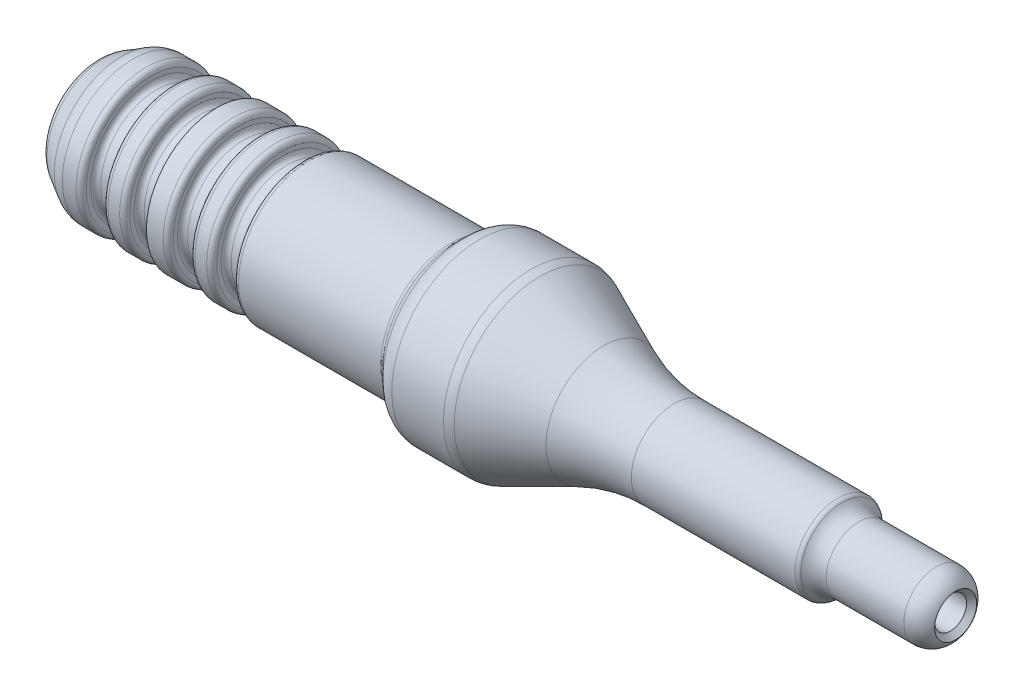
ISO-10303-21;
HEADER;
FILE_DESCRIPTION(('STEP AP214'),'2;1');
FILE_NAME('part.step','',(''),(''),'','','');
FILE_SCHEMA(('AUTOMOTIVE_DESIGN { 1 0 10303 214 1 1 1 1 }'));
ENDSEC;
DATA;
#1=APPLICATION_CONTEXT('core data for automotive mechanical design processes');
#2=APPLICATION_PROTOCOL_DEFINITION('international standard','automotive_design',2000,#1);
#3=PRODUCT_CONTEXT('',#1,'mechanical');
#4=PRODUCT('Part','Part','',(#3));
#5=PRODUCT_RELATED_PRODUCT_CATEGORY('part','',(#4));
#6=PRODUCT_DEFINITION_FORMATION('','',#4);
#7=PRODUCT_DEFINITION_CONTEXT('part definition',#1,'design');
#8=PRODUCT_DEFINITION('design','',#6,#7);
#9=PRODUCT_DEFINITION_SHAPE('','',#8);
#10=(LENGTH_UNIT() NAMED_UNIT(*) SI_UNIT(.MILLI.,.METRE.));
#11=(NAMED_UNIT(*) PLANE_ANGLE_UNIT() SI_UNIT($,.RADIAN.));
#12=(NAMED_UNIT(*) SI_UNIT($,.STERADIAN.) SOLID_ANGLE_UNIT());
#13=UNCERTAINTY_MEASURE_WITH_UNIT(LENGTH_MEASURE(1.E-05),#10,'distance_accuracy_value','');
#14=(GEOMETRIC_REPRESENTATION_CONTEXT(3) GLOBAL_UNCERTAINTY_ASSIGNED_CONTEXT((#13)) GLOBAL_UNIT_ASSIGNED_CONTEXT((#10,
#11,#12)) REPRESENTATION_CONTEXT('',''));
#15=CARTESIAN_POINT('',(0.,0.,0.));
#16=DIRECTION('',(0.,0.,1.));
#17=DIRECTION('',(1.,0.,0.));
#18=AXIS2_PLACEMENT_3D('',#15,#16,#17);
#19=CARTESIAN_POINT('',(0.,0.,0.));
#20=DIRECTION('',(-1.,0.,0.));
#21=DIRECTION('',(0.,-1.,0.));
#22=AXIS2_PLACEMENT_3D('',#19,#20,#21);
#23=CYLINDRICAL_SURFACE('',#22,4.84790561913614);
#24=CARTESIAN_POINT('',(24.6550252531694,0.,0.));
#25=DIRECTION('',(-1.,0.,0.));
#26=DIRECTION('',(0.,-1.,0.));
#27=AXIS2_PLACEMENT_3D('',#24,#25,#26);
#28=CIRCLE('',#27,4.84790561913614);
#29=CARTESIAN_POINT('',(24.6550252531694,-4.84790561913614,0.));
#30=VERTEX_POINT('',#29);
#31=EDGE_CURVE('E65',#30,#30,#28,.T.);
#32=ORIENTED_EDGE('',*,*,#31,.T.);
#33=EDGE_LOOP('',(#32));
#34=FACE_BOUND('',#33,.T.);
#35=CARTESIAN_POINT('',(14.85,0.,0.));
#36=DIRECTION('',(-1.,0.,0.));
#37=DIRECTION('',(0.,0.,1.));
#38=AXIS2_PLACEMENT_3D('',#35,#36,#37);
#39=CIRCLE('',#38,4.84790561913614);
#40=CARTESIAN_POINT('',(14.85,0.,4.84790561913614));
#41=VERTEX_POINT('',#40);
#42=EDGE_CURVE('E68',#41,#41,#39,.F.);
#43=ORIENTED_EDGE('',*,*,#42,.T.);
#44=EDGE_LOOP('',(#43));
#45=FACE_BOUND('',#44,.T.);
#46=ADVANCED_FACE('F39',(#34,#45),#23,.T.);
#47=CARTESIAN_POINT('',(26.,0.,0.));
#48=DIRECTION('',(1.,0.,0.));
#49=DIRECTION('',(0.,1.,0.));
#50=AXIS2_PLACEMENT_3D('',#47,#48,#49);
#51=CONICAL_SURFACE('',#50,6.04790561913615,0.785398163397451);
#52=CARTESIAN_POINT('',(24.9025126265847,0.,0.));
#53=DIRECTION('',(1.,0.,0.));
#54=DIRECTION('',(0.,1.,0.));
#55=AXIS2_PLACEMENT_3D('',#52,#53,#54);
#56=CIRCLE('',#55,4.95041824572085);
#57=CARTESIAN_POINT('',(24.9025126265847,4.95041824572085,0.));
#58=VERTEX_POINT('',#57);
#59=EDGE_CURVE('E62',#58,#58,#56,.T.);
#60=ORIENTED_EDGE('',*,*,#59,.T.);
#61=EDGE_LOOP('',(#60));
#62=FACE_BOUND('',#61,.T.);
#63=CARTESIAN_POINT('',(25.5606601717798,0.,0.));
#64=DIRECTION('',(-1.,0.,0.));
#65=DIRECTION('',(0.,-1.,0.));
#66=AXIS2_PLACEMENT_3D('',#63,#64,#65);
#67=CIRCLE('',#66,5.60856579091597);
#68=CARTESIAN_POINT('',(25.5606601717798,-5.60856579091597,0.));
#69=VERTEX_POINT('',#68);
#70=EDGE_CURVE('E155',#69,#69,#67,.T.);
#71=ORIENTED_EDGE('',*,*,#70,.T.);
#72=EDGE_LOOP('',(#71));
#73=FACE_BOUND('',#72,.T.);
#74=ADVANCED_FACE('F228',(#62,#73),#51,.T.);
#75=CARTESIAN_POINT('',(0.,0.,0.));
#76=DIRECTION('',(-1.,0.,0.));
#77=DIRECTION('',(0.,-1.,0.));
#78=AXIS2_PLACEMENT_3D('',#75,#76,#77);
#79=CYLINDRICAL_SURFACE('',#78,6.04790561913615);
#80=CARTESIAN_POINT('',(30.182669802533,0.,0.));
#81=DIRECTION('',(1.,0.,0.));
#82=DIRECTION('',(0.,1.,0.));
#83=AXIS2_PLACEMENT_3D('',#80,#81,#82);
#84=CIRCLE('',#83,6.04790561913615);
#85=CARTESIAN_POINT('',(30.182669802533,6.04790561913615,0.));
#86=VERTEX_POINT('',#85);
#87=EDGE_CURVE('E161',#86,#86,#84,.F.);
#88=ORIENTED_EDGE('',*,*,#87,.T.);
#89=EDGE_LOOP('',(#88));
#90=FACE_BOUND('',#89,.T.);
#91=CARTESIAN_POINT('',(26.6213203435596,0.,0.));
#92=DIRECTION('',(1.,0.,0.));
#93=DIRECTION('',(0.,1.,0.));
#94=AXIS2_PLACEMENT_3D('',#91,#92,#93);
#95=CIRCLE('',#94,6.04790561913615);
#96=CARTESIAN_POINT('',(26.6213203435596,6.04790561913615,0.));
#97=VERTEX_POINT('',#96);
#98=EDGE_CURVE('E164',#97,#97,#95,.T.);
#99=ORIENTED_EDGE('',*,*,#98,.T.);
#100=EDGE_LOOP('',(#99));
#101=FACE_BOUND('',#100,.T.);
#102=ADVANCED_FACE('F237',(#90,#101),#79,.T.);
#103=CARTESIAN_POINT('',(37.5,0.,0.));
#104=DIRECTION('',(-1.,0.,0.));
#105=DIRECTION('',(0.,-1.,0.));
#106=AXIS2_PLACEMENT_3D('',#103,#104,#105);
#107=CONICAL_SURFACE('',#106,2.94739412510884,0.416959158301446);
#108=CARTESIAN_POINT('',(30.7901428223222,0.,0.));
#109=DIRECTION('',(1.,0.,0.));
#110=DIRECTION('',(0.,1.,0.));
#111=AXIS2_PLACEMENT_3D('',#108,#109,#110);
#112=CIRCLE('',#111,5.91939259691907);
#113=CARTESIAN_POINT('',(30.7901428223222,5.91939259691907,0.));
#114=VERTEX_POINT('',#113);
#115=EDGE_CURVE('E158',#114,#114,#112,.T.);
#116=ORIENTED_EDGE('',*,*,#115,.T.);
#117=EDGE_LOOP('',(#116));
#118=FACE_BOUND('',#117,.T.);
#119=CARTESIAN_POINT('',(35.1788574214223,0.,0.));
#120=DIRECTION('',(-1.,0.,0.));
#121=DIRECTION('',(0.,-1.,0.));
#122=AXIS2_PLACEMENT_3D('',#119,#120,#121);
#123=CIRCLE('',#122,3.97549830284547);
#124=CARTESIAN_POINT('',(35.1788574214223,-3.97549830284547,0.));
#125=VERTEX_POINT('',#124);
#126=EDGE_CURVE('E194',#125,#125,#123,.T.);
#127=ORIENTED_EDGE('',*,*,#126,.T.);
#128=EDGE_LOOP('',(#127));
#129=FACE_BOUND('',#128,.T.);
#130=ADVANCED_FACE('F447',(#118,#129),#107,.T.);
#131=CARTESIAN_POINT('',(0.,0.,0.));
#132=DIRECTION('',(-1.,0.,0.));
#133=DIRECTION('',(0.,-1.,0.));
#134=AXIS2_PLACEMENT_3D('',#131,#132,#133);
#135=CYLINDRICAL_SURFACE('',#134,2.94739412510884);
#136=CARTESIAN_POINT('',(51.3201451434573,0.,0.));
#137=DIRECTION('',(1.,0.,0.));
#138=DIRECTION('',(0.,1.,0.));
#139=AXIS2_PLACEMENT_3D('',#136,#137,#138);
#140=CIRCLE('',#139,2.94739412510884);
#141=CARTESIAN_POINT('',(51.3201451434573,2.94739412510884,0.));
#142=VERTEX_POINT('',#141);
#143=EDGE_CURVE('E74',#142,#142,#140,.F.);
#144=ORIENTED_EDGE('',*,*,#143,.T.);
#145=EDGE_LOOP('',(#144));
#146=FACE_BOUND('',#145,.T.);
#147=CARTESIAN_POINT('',(40.0386415797363,0.,0.));
#148=DIRECTION('',(-1.,0.,0.));
#149=DIRECTION('',(0.,-1.,0.));
#150=AXIS2_PLACEMENT_3D('',#147,#148,#149);
#151=CIRCLE('',#150,2.94739412510884);
#152=CARTESIAN_POINT('',(40.0386415797363,-2.94739412510884,0.));
#153=VERTEX_POINT('',#152);
#154=EDGE_CURVE('E191',#153,#153,#151,.F.);
#155=ORIENTED_EDGE('',*,*,#154,.T.);
#156=EDGE_LOOP('',(#155));
#157=FACE_BOUND('',#156,.T.);
#158=ADVANCED_FACE('F449',(#146,#157),#135,.T.);
#159=CARTESIAN_POINT('',(0.,0.,0.));
#160=DIRECTION('',(-1.,0.,0.));
#161=DIRECTION('',(0.,-1.,0.));
#162=AXIS2_PLACEMENT_3D('',#159,#160,#161);
#163=CYLINDRICAL_SURFACE('',#162,2.25);
#164=CARTESIAN_POINT('',(58.1259907697207,0.,0.));
#165=DIRECTION('',(1.,0.,0.));
#166=DIRECTION('',(0.,1.,0.));
#167=AXIS2_PLACEMENT_3D('',#164,#165,#166);
#168=CIRCLE('',#167,2.25);
#169=CARTESIAN_POINT('',(58.1259907697207,2.25,0.));
#170=VERTEX_POINT('',#169);
#171=EDGE_CURVE('E149',#170,#170,#168,.F.);
#172=ORIENTED_EDGE('',*,*,#171,.T.);
#173=EDGE_LOOP('',(#172));
#174=FACE_BOUND('',#173,.T.);
#175=CARTESIAN_POINT('',(52.7672110359329,0.,0.));
#176=DIRECTION('',(-1.,0.,0.));
#177=DIRECTION('',(0.,-1.,0.));
#178=AXIS2_PLACEMENT_3D('',#175,#176,#177);
#179=CIRCLE('',#178,2.25);
#180=CARTESIAN_POINT('',(52.7672110359329,-2.25,0.));
#181=VERTEX_POINT('',#180);
#182=EDGE_CURVE('E152',#181,#181,#179,.F.);
#183=ORIENTED_EDGE('',*,*,#182,.T.);
#184=EDGE_LOOP('',(#183));
#185=FACE_BOUND('',#184,.T.);
#186=ADVANCED_FACE('F456',(#174,#185),#163,.T.);
#187=CARTESIAN_POINT('',(0.,0.,0.));
#188=DIRECTION('',(-1.,0.,0.));
#189=DIRECTION('',(0.,0.,1.));
#190=AXIS2_PLACEMENT_3D('',#187,#188,#189);
#191=CYLINDRICAL_SURFACE('',#190,1.1);
#192=CARTESIAN_POINT('',(59.1026406858629,0.,0.));
#193=DIRECTION('',(-1.,0.,0.));
#194=DIRECTION('',(0.,0.,1.));
#195=AXIS2_PLACEMENT_3D('',#192,#193,#194);
#196=CIRCLE('',#195,1.1);
#197=CARTESIAN_POINT('',(59.1026406858629,0.,1.1));
#198=VERTEX_POINT('',#197);
#199=EDGE_CURVE('E185',#198,#198,#196,.F.);
#200=ORIENTED_EDGE('',*,*,#199,.T.);
#201=EDGE_LOOP('',(#200));
#202=FACE_BOUND('',#201,.T.);
#203=CARTESIAN_POINT('',(35.4918584287042,0.,0.));
#204=DIRECTION('',(-1.,0.,0.));
#205=DIRECTION('',(0.,0.,1.));
#206=AXIS2_PLACEMENT_3D('',#203,#204,#205);
#207=CIRCLE('',#206,1.1);
#208=CARTESIAN_POINT('',(35.4918584287042,0.,1.1));
#209=VERTEX_POINT('',#208);
#210=EDGE_CURVE('E200',#209,#209,#207,.T.);
#211=ORIENTED_EDGE('',*,*,#210,.T.);
#212=EDGE_LOOP('',(#211));
#213=FACE_BOUND('',#212,.T.);
#214=ADVANCED_FACE('F224',(#202,#213),#191,.F.);
#215=CARTESIAN_POINT('',(35.4918584287042,0.,0.));
#216=DIRECTION('',(-1.,0.,0.));
#217=DIRECTION('',(0.,0.,1.));
#218=AXIS2_PLACEMENT_3D('',#215,#216,#217);
#219=CONICAL_SURFACE('',#218,1.1,0.5235987755983);
#220=CARTESIAN_POINT('',(33.5,0.,0.));
#221=DIRECTION('',(-1.,0.,0.));
#222=DIRECTION('',(0.,0.,1.));
#223=AXIS2_PLACEMENT_3D('',#220,#221,#222);
#224=CIRCLE('',#223,2.25);
#225=CARTESIAN_POINT('',(33.5,0.,2.25));
#226=VERTEX_POINT('',#225);
#227=EDGE_CURVE('E203',#226,#226,#224,.T.);
#228=ORIENTED_EDGE('',*,*,#227,.T.);
#229=EDGE_LOOP('',(#228));
#230=FACE_BOUND('',#229,.T.);
#231=ORIENTED_EDGE('',*,*,#210,.F.);
#232=EDGE_LOOP('',(#231));
#233=FACE_BOUND('',#232,.T.);
#234=ADVANCED_FACE('F207',(#230,#233),#219,.F.);
#235=CARTESIAN_POINT('',(0.,0.,0.));
#236=DIRECTION('',(-1.,0.,0.));
#237=DIRECTION('',(0.,0.,1.));
#238=AXIS2_PLACEMENT_3D('',#235,#236,#237);
#239=CYLINDRICAL_SURFACE('',#238,2.25);
#240=CARTESIAN_POINT('',(0.349999999999985,0.,0.));
#241=DIRECTION('',(1.,0.,0.));
#242=DIRECTION('',(0.,0.,-1.));
#243=AXIS2_PLACEMENT_3D('',#240,#241,#242);
#244=CIRCLE('',#243,2.25);
#245=CARTESIAN_POINT('',(0.349999999999985,0.,2.25));
#246=VERTEX_POINT('',#245);
#247=EDGE_CURVE('E182',#246,#246,#244,.F.);
#248=ORIENTED_EDGE('',*,*,#247,.T.);
#249=EDGE_LOOP('',(#248));
#250=FACE_BOUND('',#249,.T.);
#251=ORIENTED_EDGE('',*,*,#227,.F.);
#252=EDGE_LOOP('',(#251));
#253=FACE_BOUND('',#252,.T.);
#254=ADVANCED_FACE('F210',(#250,#253),#239,.F.);
#255=CARTESIAN_POINT('',(0.,0.,0.));
#256=DIRECTION('',(1.,0.,0.));
#257=DIRECTION('',(0.,1.,0.));
#258=AXIS2_PLACEMENT_3D('',#255,#256,#257);
#259=PLANE('',#258);
#260=CARTESIAN_POINT('',(0.,0.,0.));
#261=DIRECTION('',(1.,0.,0.));
#262=DIRECTION('',(0.,1.,0.));
#263=AXIS2_PLACEMENT_3D('',#260,#261,#262);
#264=CIRCLE('',#263,2.65397459621556);
#265=CARTESIAN_POINT('',(0.,2.65397459621556,0.));
#266=VERTEX_POINT('',#265);
#267=EDGE_CURVE('E167',#266,#266,#264,.F.);
#268=ORIENTED_EDGE('',*,*,#267,.T.);
#269=EDGE_LOOP('',(#268));
#270=FACE_BOUND('',#269,.T.);
#271=CARTESIAN_POINT('',(0.,0.,0.));
#272=DIRECTION('',(1.,0.,0.));
#273=DIRECTION('',(0.,1.,0.));
#274=AXIS2_PLACEMENT_3D('',#271,#272,#273);
#275=CIRCLE('',#274,2.59999999999999);
#276=CARTESIAN_POINT('',(0.,0.,2.59999999999999));
#277=VERTEX_POINT('',#276);
#278=EDGE_CURVE('E179',#277,#277,#275,.T.);
#279=ORIENTED_EDGE('',*,*,#278,.T.);
#280=EDGE_LOOP('',(#279));
#281=FACE_BOUND('',#280,.T.);
#282=ADVANCED_FACE('F212',(#270,#281),#259,.F.);
#283=CARTESIAN_POINT('',(2.3,0.,0.));
#284=DIRECTION('',(1.,0.,0.));
#285=DIRECTION('',(0.,1.,0.));
#286=AXIS2_PLACEMENT_3D('',#283,#284,#285);
#287=CONICAL_SURFACE('',#286,4.84790561913614,0.5235987755983);
#288=CARTESIAN_POINT('',(1.95192378864669,0.,0.));
#289=DIRECTION('',(-1.,0.,0.));
#290=DIRECTION('',(0.,-1.,0.));
#291=AXIS2_PLACEMENT_3D('',#288,#289,#290);
#292=CIRCLE('',#291,4.6469437248128);
#293=CARTESIAN_POINT('',(1.95192378864669,-4.6469437248128,0.));
#294=VERTEX_POINT('',#293);
#295=EDGE_CURVE('E173',#294,#294,#292,.T.);
#296=ORIENTED_EDGE('',*,*,#295,.T.);
#297=EDGE_LOOP('',(#296));
#298=FACE_BOUND('',#297,.T.);
#299=CARTESIAN_POINT('',(0.749999999999999,0.,0.));
#300=DIRECTION('',(-1.,0.,0.));
#301=DIRECTION('',(0.,-1.,0.));
#302=AXIS2_PLACEMENT_3D('',#299,#300,#301);
#303=CIRCLE('',#302,3.95301270189222);
#304=CARTESIAN_POINT('',(0.749999999999999,-3.95301270189222,0.));
#305=VERTEX_POINT('',#304);
#306=EDGE_CURVE('E176',#305,#305,#303,.F.);
#307=ORIENTED_EDGE('',*,*,#306,.T.);
#308=EDGE_LOOP('',(#307));
#309=FACE_BOUND('',#308,.T.);
#310=ADVANCED_FACE('F220',(#298,#309),#287,.T.);
#311=CARTESIAN_POINT('',(3.65,0.,0.));
#312=DIRECTION('',(1.,0.,0.));
#313=DIRECTION('',(0.,0.,-1.));
#314=AXIS2_PLACEMENT_3D('',#311,#312,#313);
#315=CIRCLE('',#314,4.84790561913614);
#316=CARTESIAN_POINT('',(3.65,0.,-4.84790561913614));
#317=VERTEX_POINT('',#316);
#318=EDGE_CURVE('E10',#317,#317,#315,.F.);
#319=ORIENTED_EDGE('',*,*,#318,.T.);
#320=EDGE_LOOP('',(#319));
#321=FACE_BOUND('',#320,.T.);
#322=CARTESIAN_POINT('',(2.70192378864669,0.,0.));
#323=DIRECTION('',(1.,0.,0.));
#324=DIRECTION('',(0.,1.,0.));
#325=AXIS2_PLACEMENT_3D('',#322,#323,#324);
#326=CIRCLE('',#325,4.84790561913614);
#327=CARTESIAN_POINT('',(2.70192378864669,4.84790561913614,0.));
#328=VERTEX_POINT('',#327);
#329=EDGE_CURVE('E170',#328,#328,#326,.T.);
#330=ORIENTED_EDGE('',*,*,#329,.T.);
#331=EDGE_LOOP('',(#330));
#332=FACE_BOUND('',#331,.T.);
#333=ADVANCED_FACE('F232',(#321,#332),#23,.T.);
#334=CARTESIAN_POINT('',(14.5,4.85,0.));
#335=DIRECTION('',(-1.,0.,0.));
#336=DIRECTION('',(0.,0.,1.));
#337=AXIS2_PLACEMENT_3D('',#334,#335,#336);
#338=PLANE('',#337);
#339=CARTESIAN_POINT('',(14.5,0.,0.));
#340=DIRECTION('',(-1.,0.,0.));
#341=DIRECTION('',(0.,0.,1.));
#342=AXIS2_PLACEMENT_3D('',#339,#340,#341);
#343=CIRCLE('',#342,4.2);
#344=CARTESIAN_POINT('',(14.5,0.,4.2));
#345=VERTEX_POINT('',#344);
#346=EDGE_CURVE('E122',#345,#345,#343,.F.);
#347=ORIENTED_EDGE('',*,*,#346,.T.);
#348=EDGE_LOOP('',(#347));
#349=FACE_BOUND('',#348,.T.);
#350=CARTESIAN_POINT('',(14.5,0.,0.));
#351=DIRECTION('',(-1.,0.,0.));
#352=DIRECTION('',(0.,0.,1.));
#353=AXIS2_PLACEMENT_3D('',#350,#351,#352);
#354=CIRCLE('',#353,4.49790561913615);
#355=CARTESIAN_POINT('',(14.5,0.,4.49790561913615));
#356=VERTEX_POINT('',#355);
#357=EDGE_CURVE('E125',#356,#356,#354,.T.);
#358=ORIENTED_EDGE('',*,*,#357,.T.);
#359=EDGE_LOOP('',(#358));
#360=FACE_BOUND('',#359,.T.);
#361=ADVANCED_FACE('F248',(#349,#360),#338,.T.);
#362=CARTESIAN_POINT('',(13.,4.85,0.));
#363=DIRECTION('',(1.,0.,0.));
#364=DIRECTION('',(0.,0.,-1.));
#365=AXIS2_PLACEMENT_3D('',#362,#363,#364);
#366=PLANE('',#365);
#367=CARTESIAN_POINT('',(13.,0.,0.));
#368=DIRECTION('',(1.,0.,0.));
#369=DIRECTION('',(0.,0.,-1.));
#370=AXIS2_PLACEMENT_3D('',#367,#368,#369);
#371=CIRCLE('',#370,4.2);
#372=CARTESIAN_POINT('',(13.,0.,-4.2));
#373=VERTEX_POINT('',#372);
#374=EDGE_CURVE('E134',#373,#373,#371,.F.);
#375=ORIENTED_EDGE('',*,*,#374,.T.);
#376=EDGE_LOOP('',(#375));
#377=FACE_BOUND('',#376,.T.);
#378=CARTESIAN_POINT('',(13.,0.,0.));
#379=DIRECTION('',(1.,0.,0.));
#380=DIRECTION('',(0.,0.,-1.));
#381=AXIS2_PLACEMENT_3D('',#378,#379,#380);
#382=CIRCLE('',#381,4.49790561913615);
#383=CARTESIAN_POINT('',(13.,0.,-4.49790561913615));
#384=VERTEX_POINT('',#383);
#385=EDGE_CURVE('E137',#384,#384,#382,.T.);
#386=ORIENTED_EDGE('',*,*,#385,.T.);
#387=EDGE_LOOP('',(#386));
#388=FACE_BOUND('',#387,.T.);
#389=ADVANCED_FACE('F253',(#377,#388),#366,.T.);
#390=CARTESIAN_POINT('',(0.,0.,0.));
#391=DIRECTION('',(-1.,0.,0.));
#392=DIRECTION('',(0.,0.,1.));
#393=AXIS2_PLACEMENT_3D('',#390,#391,#392);
#394=CYLINDRICAL_SURFACE('',#393,3.85);
#395=CARTESIAN_POINT('',(13.35,0.,0.));
#396=DIRECTION('',(1.,0.,0.));
#397=DIRECTION('',(0.,0.,-1.));
#398=AXIS2_PLACEMENT_3D('',#395,#396,#397);
#399=CIRCLE('',#398,3.85);
#400=CARTESIAN_POINT('',(13.35,0.,-3.85));
#401=VERTEX_POINT('',#400);
#402=EDGE_CURVE('E128',#401,#401,#399,.T.);
#403=ORIENTED_EDGE('',*,*,#402,.T.);
#404=EDGE_LOOP('',(#403));
#405=FACE_BOUND('',#404,.T.);
#406=CARTESIAN_POINT('',(14.15,0.,0.));
#407=DIRECTION('',(-1.,0.,0.));
#408=DIRECTION('',(0.,0.,1.));
#409=AXIS2_PLACEMENT_3D('',#406,#407,#408);
#410=CIRCLE('',#409,3.85);
#411=CARTESIAN_POINT('',(14.15,0.,3.85));
#412=VERTEX_POINT('',#411);
#413=EDGE_CURVE('E131',#412,#412,#410,.T.);
#414=ORIENTED_EDGE('',*,*,#413,.T.);
#415=EDGE_LOOP('',(#414));
#416=FACE_BOUND('',#415,.T.);
#417=ADVANCED_FACE('F372',(#405,#416),#394,.T.);
#418=CARTESIAN_POINT('',(4.,4.85,0.));
#419=DIRECTION('',(1.,0.,0.));
#420=DIRECTION('',(0.,0.,-1.));
#421=AXIS2_PLACEMENT_3D('',#418,#419,#420);
#422=PLANE('',#421);
#423=CARTESIAN_POINT('',(4.,0.,0.));
#424=DIRECTION('',(1.,0.,0.));
#425=DIRECTION('',(0.,0.,-1.));
#426=AXIS2_PLACEMENT_3D('',#423,#424,#425);
#427=CIRCLE('',#426,4.2);
#428=CARTESIAN_POINT('',(4.,0.,-4.2));
#429=VERTEX_POINT('',#428);
#430=EDGE_CURVE('E46',#429,#429,#427,.F.);
#431=ORIENTED_EDGE('',*,*,#430,.T.);
#432=EDGE_LOOP('',(#431));
#433=FACE_BOUND('',#432,.T.);
#434=CARTESIAN_POINT('',(4.,0.,0.));
#435=DIRECTION('',(1.,0.,0.));
#436=DIRECTION('',(0.,0.,-1.));
#437=AXIS2_PLACEMENT_3D('',#434,#435,#436);
#438=CIRCLE('',#437,4.49790561913615);
#439=CARTESIAN_POINT('',(4.,0.,-4.49790561913615));
#440=VERTEX_POINT('',#439);
#441=EDGE_CURVE('E50',#440,#440,#438,.T.);
#442=ORIENTED_EDGE('',*,*,#441,.T.);
#443=EDGE_LOOP('',(#442));
#444=FACE_BOUND('',#443,.T.);
#445=ADVANCED_FACE('F366',(#433,#444),#422,.T.);
#446=CARTESIAN_POINT('',(5.5,4.85,0.));
#447=DIRECTION('',(-1.,0.,0.));
#448=DIRECTION('',(0.,0.,1.));
#449=AXIS2_PLACEMENT_3D('',#446,#447,#448);
#450=PLANE('',#449);
#451=CARTESIAN_POINT('',(5.5,0.,0.));
#452=DIRECTION('',(-1.,0.,0.));
#453=DIRECTION('',(0.,0.,1.));
#454=AXIS2_PLACEMENT_3D('',#451,#452,#453);
#455=CIRCLE('',#454,4.49790561913615);
#456=CARTESIAN_POINT('',(5.5,0.,4.49790561913615));
#457=VERTEX_POINT('',#456);
#458=EDGE_CURVE('E77',#457,#457,#455,.T.);
#459=ORIENTED_EDGE('',*,*,#458,.T.);
#460=EDGE_LOOP('',(#459));
#461=FACE_BOUND('',#460,.T.);
#462=CARTESIAN_POINT('',(5.5,0.,0.));
#463=DIRECTION('',(-1.,0.,0.));
#464=DIRECTION('',(0.,0.,1.));
#465=AXIS2_PLACEMENT_3D('',#462,#463,#464);
#466=CIRCLE('',#465,4.2);
#467=CARTESIAN_POINT('',(5.5,0.,4.2));
#468=VERTEX_POINT('',#467);
#469=EDGE_CURVE('E80',#468,#468,#466,.F.);
#470=ORIENTED_EDGE('',*,*,#469,.T.);
#471=EDGE_LOOP('',(#470));
#472=FACE_BOUND('',#471,.T.);
#473=ADVANCED_FACE('F360',(#461,#472),#450,.T.);
#474=CARTESIAN_POINT('',(0.,0.,0.));
#475=DIRECTION('',(-1.,0.,0.));
#476=DIRECTION('',(0.,0.,1.));
#477=AXIS2_PLACEMENT_3D('',#474,#475,#476);
#478=CYLINDRICAL_SURFACE('',#477,3.85);
#479=CARTESIAN_POINT('',(5.15,0.,0.));
#480=DIRECTION('',(-1.,0.,0.));
#481=DIRECTION('',(0.,0.,1.));
#482=AXIS2_PLACEMENT_3D('',#479,#480,#481);
#483=CIRCLE('',#482,3.85);
#484=CARTESIAN_POINT('',(5.15,0.,3.85));
#485=VERTEX_POINT('',#484);
#486=EDGE_CURVE('E54',#485,#485,#483,.T.);
#487=ORIENTED_EDGE('',*,*,#486,.T.);
#488=EDGE_LOOP('',(#487));
#489=FACE_BOUND('',#488,.T.);
#490=CARTESIAN_POINT('',(4.35,0.,0.));
#491=DIRECTION('',(1.,0.,0.));
#492=DIRECTION('',(0.,0.,-1.));
#493=AXIS2_PLACEMENT_3D('',#490,#491,#492);
#494=CIRCLE('',#493,3.85);
#495=CARTESIAN_POINT('',(4.35,0.,-3.85));
#496=VERTEX_POINT('',#495);
#497=EDGE_CURVE('E59',#496,#496,#494,.T.);
#498=ORIENTED_EDGE('',*,*,#497,.T.);
#499=EDGE_LOOP('',(#498));
#500=FACE_BOUND('',#499,.T.);
#501=ADVANCED_FACE('F244',(#489,#500),#478,.T.);
#502=CARTESIAN_POINT('',(12.65,0.,0.));
#503=DIRECTION('',(1.,0.,0.));
#504=DIRECTION('',(0.,0.,-1.));
#505=AXIS2_PLACEMENT_3D('',#502,#503,#504);
#506=CIRCLE('',#505,4.84790561913614);
#507=CARTESIAN_POINT('',(12.65,0.,-4.84790561913614));
#508=VERTEX_POINT('',#507);
#509=EDGE_CURVE('E116',#508,#508,#506,.F.);
#510=ORIENTED_EDGE('',*,*,#509,.T.);
#511=EDGE_LOOP('',(#510));
#512=FACE_BOUND('',#511,.T.);
#513=CARTESIAN_POINT('',(11.85,0.,0.));
#514=DIRECTION('',(-1.,0.,0.));
#515=DIRECTION('',(0.,0.,1.));
#516=AXIS2_PLACEMENT_3D('',#513,#514,#515);
#517=CIRCLE('',#516,4.84790561913614);
#518=CARTESIAN_POINT('',(11.85,0.,4.84790561913614));
#519=VERTEX_POINT('',#518);
#520=EDGE_CURVE('E119',#519,#519,#517,.F.);
#521=ORIENTED_EDGE('',*,*,#520,.T.);
#522=EDGE_LOOP('',(#521));
#523=FACE_BOUND('',#522,.T.);
#524=ADVANCED_FACE('F231',(#512,#523),#23,.T.);
#525=CARTESIAN_POINT('',(6.65,0.,0.));
#526=DIRECTION('',(1.,0.,0.));
#527=DIRECTION('',(0.,0.,-1.));
#528=AXIS2_PLACEMENT_3D('',#525,#526,#527);
#529=CIRCLE('',#528,4.84790561913614);
#530=CARTESIAN_POINT('',(6.65,0.,-4.84790561913614));
#531=VERTEX_POINT('',#530);
#532=EDGE_CURVE('E83',#531,#531,#529,.F.);
#533=ORIENTED_EDGE('',*,*,#532,.T.);
#534=EDGE_LOOP('',(#533));
#535=FACE_BOUND('',#534,.T.);
#536=CARTESIAN_POINT('',(5.85,0.,0.));
#537=DIRECTION('',(-1.,0.,0.));
#538=DIRECTION('',(0.,0.,1.));
#539=AXIS2_PLACEMENT_3D('',#536,#537,#538);
#540=CIRCLE('',#539,4.84790561913614);
#541=CARTESIAN_POINT('',(5.85,0.,4.84790561913614));
#542=VERTEX_POINT('',#541);
#543=EDGE_CURVE('E86',#542,#542,#540,.F.);
#544=ORIENTED_EDGE('',*,*,#543,.T.);
#545=EDGE_LOOP('',(#544));
#546=FACE_BOUND('',#545,.T.);
#547=ADVANCED_FACE('F243',(#535,#546),#23,.T.);
#548=CARTESIAN_POINT('',(8.5,4.85,0.));
#549=DIRECTION('',(-1.,0.,0.));
#550=DIRECTION('',(0.,0.,1.));
#551=AXIS2_PLACEMENT_3D('',#548,#549,#550);
#552=PLANE('',#551);
#553=CARTESIAN_POINT('',(8.5,0.,0.));
#554=DIRECTION('',(-1.,0.,0.));
#555=DIRECTION('',(0.,0.,1.));
#556=AXIS2_PLACEMENT_3D('',#553,#554,#555);
#557=CIRCLE('',#556,4.2);
#558=CARTESIAN_POINT('',(8.5,0.,4.2));
#559=VERTEX_POINT('',#558);
#560=EDGE_CURVE('E89',#559,#559,#557,.F.);
#561=ORIENTED_EDGE('',*,*,#560,.T.);
#562=EDGE_LOOP('',(#561));
#563=FACE_BOUND('',#562,.T.);
#564=CARTESIAN_POINT('',(8.5,0.,0.));
#565=DIRECTION('',(-1.,0.,0.));
#566=DIRECTION('',(0.,0.,1.));
#567=AXIS2_PLACEMENT_3D('',#564,#565,#566);
#568=CIRCLE('',#567,4.84790561913614);
#569=CARTESIAN_POINT('',(8.5,0.,4.84790561913614));
#570=VERTEX_POINT('',#569);
#571=EDGE_CURVE('E197',#570,#570,#568,.T.);
#572=ORIENTED_EDGE('',*,*,#571,.T.);
#573=EDGE_LOOP('',(#572));
#574=FACE_BOUND('',#573,.T.);
#575=ADVANCED_FACE('F259',(#563,#574),#552,.T.);
#576=CARTESIAN_POINT('',(7.,4.85,0.));
#577=DIRECTION('',(1.,0.,0.));
#578=DIRECTION('',(0.,0.,-1.));
#579=AXIS2_PLACEMENT_3D('',#576,#577,#578);
#580=PLANE('',#579);
#581=CARTESIAN_POINT('',(7.,0.,0.));
#582=DIRECTION('',(1.,0.,0.));
#583=DIRECTION('',(0.,0.,-1.));
#584=AXIS2_PLACEMENT_3D('',#581,#582,#583);
#585=CIRCLE('',#584,4.2);
#586=CARTESIAN_POINT('',(7.,0.,-4.2));
#587=VERTEX_POINT('',#586);
#588=EDGE_CURVE('E98',#587,#587,#585,.F.);
#589=ORIENTED_EDGE('',*,*,#588,.T.);
#590=EDGE_LOOP('',(#589));
#591=FACE_BOUND('',#590,.T.);
#592=CARTESIAN_POINT('',(7.,0.,0.));
#593=DIRECTION('',(1.,0.,0.));
#594=DIRECTION('',(0.,0.,-1.));
#595=AXIS2_PLACEMENT_3D('',#592,#593,#594);
#596=CIRCLE('',#595,4.49790561913615);
#597=CARTESIAN_POINT('',(7.,0.,-4.49790561913615));
#598=VERTEX_POINT('',#597);
#599=EDGE_CURVE('E101',#598,#598,#596,.T.);
#600=ORIENTED_EDGE('',*,*,#599,.T.);
#601=EDGE_LOOP('',(#600));
#602=FACE_BOUND('',#601,.T.);
#603=ADVANCED_FACE('F264',(#591,#602),#580,.T.);
#604=CARTESIAN_POINT('',(0.,0.,0.));
#605=DIRECTION('',(-1.,0.,0.));
#606=DIRECTION('',(0.,0.,1.));
#607=AXIS2_PLACEMENT_3D('',#604,#605,#606);
#608=CYLINDRICAL_SURFACE('',#607,3.85);
#609=CARTESIAN_POINT('',(7.35,0.,0.));
#610=DIRECTION('',(1.,0.,0.));
#611=DIRECTION('',(0.,0.,-1.));
#612=AXIS2_PLACEMENT_3D('',#609,#610,#611);
#613=CIRCLE('',#612,3.85);
#614=CARTESIAN_POINT('',(7.35,0.,-3.85));
#615=VERTEX_POINT('',#614);
#616=EDGE_CURVE('E92',#615,#615,#613,.T.);
#617=ORIENTED_EDGE('',*,*,#616,.T.);
#618=EDGE_LOOP('',(#617));
#619=FACE_BOUND('',#618,.T.);
#620=CARTESIAN_POINT('',(8.15,0.,0.));
#621=DIRECTION('',(-1.,0.,0.));
#622=DIRECTION('',(0.,0.,1.));
#623=AXIS2_PLACEMENT_3D('',#620,#621,#622);
#624=CIRCLE('',#623,3.85);
#625=CARTESIAN_POINT('',(8.15,0.,3.85));
#626=VERTEX_POINT('',#625);
#627=EDGE_CURVE('E95',#626,#626,#624,.T.);
#628=ORIENTED_EDGE('',*,*,#627,.T.);
#629=EDGE_LOOP('',(#628));
#630=FACE_BOUND('',#629,.T.);
#631=ADVANCED_FACE('F270',(#619,#630),#608,.T.);
#632=CARTESIAN_POINT('',(9.65,0.,0.));
#633=DIRECTION('',(1.,0.,0.));
#634=DIRECTION('',(0.,0.,-1.));
#635=AXIS2_PLACEMENT_3D('',#632,#633,#634);
#636=CIRCLE('',#635,4.84790561913614);
#637=CARTESIAN_POINT('',(9.65,0.,-4.84790561913614));
#638=VERTEX_POINT('',#637);
#639=EDGE_CURVE('E140',#638,#638,#636,.F.);
#640=ORIENTED_EDGE('',*,*,#639,.T.);
#641=EDGE_LOOP('',(#640));
#642=FACE_BOUND('',#641,.T.);
#643=ORIENTED_EDGE('',*,*,#571,.F.);
#644=EDGE_LOOP('',(#643));
#645=FACE_BOUND('',#644,.T.);
#646=ADVANCED_FACE('F246',(#642,#645),#23,.T.);
#647=CARTESIAN_POINT('',(11.5,4.85,0.));
#648=DIRECTION('',(-1.,0.,0.));
#649=DIRECTION('',(0.,0.,1.));
#650=AXIS2_PLACEMENT_3D('',#647,#648,#649);
#651=PLANE('',#650);
#652=CARTESIAN_POINT('',(11.5,0.,0.));
#653=DIRECTION('',(-1.,0.,0.));
#654=DIRECTION('',(0.,0.,1.));
#655=AXIS2_PLACEMENT_3D('',#652,#653,#654);
#656=CIRCLE('',#655,4.49790561913615);
#657=CARTESIAN_POINT('',(11.5,0.,4.49790561913615));
#658=VERTEX_POINT('',#657);
#659=EDGE_CURVE('E110',#658,#658,#656,.T.);
#660=ORIENTED_EDGE('',*,*,#659,.T.);
#661=EDGE_LOOP('',(#660));
#662=FACE_BOUND('',#661,.T.);
#663=CARTESIAN_POINT('',(11.5,0.,0.));
#664=DIRECTION('',(-1.,0.,0.));
#665=DIRECTION('',(0.,0.,1.));
#666=AXIS2_PLACEMENT_3D('',#663,#664,#665);
#667=CIRCLE('',#666,4.2);
#668=CARTESIAN_POINT('',(11.5,0.,4.2));
#669=VERTEX_POINT('',#668);
#670=EDGE_CURVE('E113',#669,#669,#667,.F.);
#671=ORIENTED_EDGE('',*,*,#670,.T.);
#672=EDGE_LOOP('',(#671));
#673=FACE_BOUND('',#672,.T.);
#674=ADVANCED_FACE('F269',(#662,#673),#651,.T.);
#675=CARTESIAN_POINT('',(10.,4.85,0.));
#676=DIRECTION('',(1.,0.,0.));
#677=DIRECTION('',(0.,0.,-1.));
#678=AXIS2_PLACEMENT_3D('',#675,#676,#677);
#679=PLANE('',#678);
#680=CARTESIAN_POINT('',(10.,0.,0.));
#681=DIRECTION('',(1.,0.,0.));
#682=DIRECTION('',(0.,0.,-1.));
#683=AXIS2_PLACEMENT_3D('',#680,#681,#682);
#684=CIRCLE('',#683,4.49790561913615);
#685=CARTESIAN_POINT('',(10.,0.,-4.49790561913615));
#686=VERTEX_POINT('',#685);
#687=EDGE_CURVE('E143',#686,#686,#684,.T.);
#688=ORIENTED_EDGE('',*,*,#687,.T.);
#689=EDGE_LOOP('',(#688));
#690=FACE_BOUND('',#689,.T.);
#691=CARTESIAN_POINT('',(10.,0.,0.));
#692=DIRECTION('',(1.,0.,0.));
#693=DIRECTION('',(0.,0.,-1.));
#694=AXIS2_PLACEMENT_3D('',#691,#692,#693);
#695=CIRCLE('',#694,4.2);
#696=CARTESIAN_POINT('',(10.,0.,-4.2));
#697=VERTEX_POINT('',#696);
#698=EDGE_CURVE('E146',#697,#697,#695,.F.);
#699=ORIENTED_EDGE('',*,*,#698,.T.);
#700=EDGE_LOOP('',(#699));
#701=FACE_BOUND('',#700,.T.);
#702=ADVANCED_FACE('F276',(#690,#701),#679,.T.);
#703=CARTESIAN_POINT('',(0.,0.,0.));
#704=DIRECTION('',(-1.,0.,0.));
#705=DIRECTION('',(0.,0.,1.));
#706=AXIS2_PLACEMENT_3D('',#703,#704,#705);
#707=CYLINDRICAL_SURFACE('',#706,3.85);
#708=CARTESIAN_POINT('',(10.35,0.,0.));
#709=DIRECTION('',(1.,0.,0.));
#710=DIRECTION('',(0.,0.,-1.));
#711=AXIS2_PLACEMENT_3D('',#708,#709,#710);
#712=CIRCLE('',#711,3.85);
#713=CARTESIAN_POINT('',(10.35,0.,-3.85));
#714=VERTEX_POINT('',#713);
#715=EDGE_CURVE('E104',#714,#714,#712,.T.);
#716=ORIENTED_EDGE('',*,*,#715,.T.);
#717=EDGE_LOOP('',(#716));
#718=FACE_BOUND('',#717,.T.);
#719=CARTESIAN_POINT('',(11.15,0.,0.));
#720=DIRECTION('',(-1.,0.,0.));
#721=DIRECTION('',(0.,0.,1.));
#722=AXIS2_PLACEMENT_3D('',#719,#720,#721);
#723=CIRCLE('',#722,3.85);
#724=CARTESIAN_POINT('',(11.15,0.,3.85));
#725=VERTEX_POINT('',#724);
#726=EDGE_CURVE('E107',#725,#725,#723,.T.);
#727=ORIENTED_EDGE('',*,*,#726,.T.);
#728=EDGE_LOOP('',(#727));
#729=FACE_BOUND('',#728,.T.);
#730=ADVANCED_FACE('F296',(#718,#729),#707,.T.);
#731=CARTESIAN_POINT('',(40.0386415797363,0.,0.));
#732=DIRECTION('',(-1.,0.,0.));
#733=DIRECTION('',(0.,-1.,0.));
#734=AXIS2_PLACEMENT_3D('',#731,#732,#733);
#735=TOROIDAL_SURFACE('',#734,14.9473941251088,12.);
#736=ORIENTED_EDGE('',*,*,#154,.F.);
#737=EDGE_LOOP('',(#736));
#738=FACE_BOUND('',#737,.T.);
#739=ORIENTED_EDGE('',*,*,#126,.F.);
#740=EDGE_LOOP('',(#739));
#741=FACE_BOUND('',#740,.T.);
#742=ADVANCED_FACE('F377',(#738,#741),#735,.F.);
#743=CARTESIAN_POINT('',(59.4526406858628,0.,0.));
#744=DIRECTION('',(1.,0.,0.));
#745=DIRECTION('',(0.,0.,-1.));
#746=AXIS2_PLACEMENT_3D('',#743,#744,#745);
#747=CONICAL_SURFACE('',#746,1.44999999999999,0.785398163397444);
#748=ORIENTED_EDGE('',*,*,#199,.F.);
#749=EDGE_LOOP('',(#748));
#750=FACE_BOUND('',#749,.T.);
#751=CARTESIAN_POINT('',(59.4526406858628,0.,0.));
#752=DIRECTION('',(-1.,0.,0.));
#753=DIRECTION('',(0.,-1.,0.));
#754=AXIS2_PLACEMENT_3D('',#751,#752,#753);
#755=CIRCLE('',#754,1.44999999999999);
#756=CARTESIAN_POINT('',(59.4526406858628,-1.44999999999999,0.));
#757=VERTEX_POINT('',#756);
#758=EDGE_CURVE('E188',#757,#757,#755,.T.);
#759=ORIENTED_EDGE('',*,*,#758,.F.);
#760=EDGE_LOOP('',(#759));
#761=FACE_BOUND('',#760,.T.);
#762=ADVANCED_FACE('F433',(#750,#761),#747,.F.);
#763=CARTESIAN_POINT('',(0.349999999999985,0.,0.));
#764=DIRECTION('',(-1.,0.,0.));
#765=DIRECTION('',(0.,0.,1.));
#766=AXIS2_PLACEMENT_3D('',#763,#764,#765);
#767=CONICAL_SURFACE('',#766,2.25,0.785398163397457);
#768=CARTESIAN_POINT('',(0.,0.,2.59999999999999));
#769=CARTESIAN_POINT('',(0.00364583333333313,0.,2.59635416666666));
#770=CARTESIAN_POINT('',(0.00729166666666632,0.,2.59270833333332));
#771=CARTESIAN_POINT('',(0.0145833333333327,0.,2.58541666666666));
#772=CARTESIAN_POINT('',(0.0182291666666659,0.,2.58177083333333));
#773=CARTESIAN_POINT('',(0.0255208333333322,0.,2.57447916666666));
#774=CARTESIAN_POINT('',(0.0291666666666654,0.,2.57083333333333));
#775=CARTESIAN_POINT('',(0.0364583333333318,0.,2.56354166666666));
#776=CARTESIAN_POINT('',(0.040104166666665,0.,2.55989583333333));
#777=CARTESIAN_POINT('',(0.0473958333333313,0.,2.55260416666666));
#778=CARTESIAN_POINT('',(0.0510416666666644,0.,2.54895833333333));
#779=CARTESIAN_POINT('',(0.0583333333333308,0.,2.54166666666666));
#780=CARTESIAN_POINT('',(0.061979166666664,0.,2.53802083333333));
#781=CARTESIAN_POINT('',(0.0692708333333304,0.,2.53072916666666));
#782=CARTESIAN_POINT('',(0.0729166666666636,0.,2.52708333333333));
#783=CARTESIAN_POINT('',(0.0802083333333299,0.,2.51979166666666));
#784=CARTESIAN_POINT('',(0.0838541666666631,0.,2.51614583333333));
#785=CARTESIAN_POINT('',(0.0911458333333294,0.,2.50885416666666));
#786=CARTESIAN_POINT('',(0.0947916666666626,0.,2.50520833333333));
#787=CARTESIAN_POINT('',(0.102083333333329,0.,2.49791666666666));
#788=CARTESIAN_POINT('',(0.105729166666662,0.,2.49427083333333));
#789=CARTESIAN_POINT('',(0.113020833333329,0.,2.48697916666666));
#790=CARTESIAN_POINT('',(0.116666666666662,0.,2.48333333333333));
#791=CARTESIAN_POINT('',(0.123958333333328,0.,2.47604166666666));
#792=CARTESIAN_POINT('',(0.127604166666661,0.,2.47239583333333));
#793=CARTESIAN_POINT('',(0.134895833333328,0.,2.46510416666666));
#794=CARTESIAN_POINT('',(0.138541666666661,0.,2.46145833333333));
#795=CARTESIAN_POINT('',(0.145833333333327,0.,2.45416666666666));
#796=CARTESIAN_POINT('',(0.14947916666666,0.,2.45052083333333));
#797=CARTESIAN_POINT('',(0.156770833333327,0.,2.44322916666666));
#798=CARTESIAN_POINT('',(0.16041666666666,0.,2.43958333333333));
#799=CARTESIAN_POINT('',(0.167708333333326,0.,2.43229166666666));
#800=CARTESIAN_POINT('',(0.171354166666659,0.,2.42864583333333));
#801=CARTESIAN_POINT('',(0.178645833333326,0.,2.42135416666666));
#802=CARTESIAN_POINT('',(0.182291666666659,0.,2.41770833333333));
#803=CARTESIAN_POINT('',(0.189583333333325,0.,2.41041666666666));
#804=CARTESIAN_POINT('',(0.193229166666659,0.,2.40677083333333));
#805=CARTESIAN_POINT('',(0.200520833333325,0.,2.39947916666666));
#806=CARTESIAN_POINT('',(0.204166666666658,0.,2.39583333333333));
#807=CARTESIAN_POINT('',(0.211458333333324,0.,2.38854166666666));
#808=CARTESIAN_POINT('',(0.215104166666658,0.,2.38489583333333));
#809=CARTESIAN_POINT('',(0.222395833333324,0.,2.37760416666666));
#810=CARTESIAN_POINT('',(0.226041666666657,0.,2.37395833333333));
#811=CARTESIAN_POINT('',(0.233333333333324,0.,2.36666666666666));
#812=CARTESIAN_POINT('',(0.236979166666657,0.,2.36302083333333));
#813=CARTESIAN_POINT('',(0.244270833333323,0.,2.35572916666666));
#814=CARTESIAN_POINT('',(0.247916666666656,0.,2.35208333333333));
#815=CARTESIAN_POINT('',(0.255208333333323,0.,2.34479166666666));
#816=CARTESIAN_POINT('',(0.258854166666656,0.,2.34114583333333));
#817=CARTESIAN_POINT('',(0.266145833333322,0.,2.33385416666666));
#818=CARTESIAN_POINT('',(0.269791666666655,0.,2.33020833333333));
#819=CARTESIAN_POINT('',(0.277083333333322,0.,2.32291666666666));
#820=CARTESIAN_POINT('',(0.280729166666655,0.,2.31927083333333));
#821=CARTESIAN_POINT('',(0.288020833333321,0.,2.31197916666666));
#822=CARTESIAN_POINT('',(0.291666666666654,0.,2.30833333333333));
#823=CARTESIAN_POINT('',(0.298958333333321,0.,2.30104166666667));
#824=CARTESIAN_POINT('',(0.302604166666654,0.,2.29739583333333));
#825=CARTESIAN_POINT('',(0.30989583333332,0.,2.29010416666667));
#826=CARTESIAN_POINT('',(0.313541666666654,0.,2.28645833333333));
#827=CARTESIAN_POINT('',(0.32083333333332,0.,2.27916666666667));
#828=CARTESIAN_POINT('',(0.324479166666653,0.,2.27552083333333));
#829=CARTESIAN_POINT('',(0.331770833333319,0.,2.26822916666667));
#830=CARTESIAN_POINT('',(0.335416666666653,0.,2.26458333333333));
#831=CARTESIAN_POINT('',(0.342708333333319,0.,2.25729166666667));
#832=CARTESIAN_POINT('',(0.346354166666652,0.,2.25364583333333));
#833=CARTESIAN_POINT('',(0.349999999999985,0.,2.25));
#834=B_SPLINE_CURVE_WITH_KNOTS('',3,(#768,#769,#770,#771,#772,#773,#774,#775,#776,#777,#778,
#779,#780,#781,#782,#783,#784,#785,#786,#787,#788,#789,#790,#791,#792,#793,#794,#795,#796,#797,
#798,#799,#800,#801,#802,#803,#804,#805,#806,#807,#808,#809,#810,#811,#812,#813,#814,#815,#816,
#817,#818,#819,#820,#821,#822,#823,#824,#825,#826,#827,#828,#829,#830,#831,#832,#833),
.UNSPECIFIED.,.F.,.F.,(4,2,2,2,2,2,2,2,2,2,2,2,2,2,2,2,2,2,2,2,2,2,2,2,2,2,2,2,2,2,2,2,4),(0.,
0.0154679608384552,0.0309359216769103,0.0464038825153655,0.0618718433538206,0.0773398041922761,
0.0928077650307313,0.108275725869186,0.123743686707642,0.139211647546097,0.154679608384552,
0.170147569223007,0.185615530061463,0.201083490899918,0.216551451738373,0.232019412576828,
0.247487373415283,0.262955334253739,0.278423295092194,0.293891255930649,0.309359216769104,
0.324827177607559,0.340295138446015,0.35576309928447,0.371231060122925,0.38669902096138,
0.402166981799835,0.417634942638291,0.433102903476746,0.448570864315201,0.464038825153656,
0.479506785992111,0.494974746830567),.UNSPECIFIED.);
#835=EDGE_CURVE('BSEAM425',#277,#246,#834,.T.);
#836=ORIENTED_EDGE('',*,*,#278,.F.);
#837=ORIENTED_EDGE('',*,*,#247,.F.);
#838=ORIENTED_EDGE('',*,*,#835,.T.);
#839=ORIENTED_EDGE('',*,*,#835,.F.);
#840=EDGE_LOOP('',(#836,#838,#837,#839));
#841=FACE_BOUND('',#840,.T.);
#842=ADVANCED_FACE('F425',(#841),#767,.F.);
#843=CARTESIAN_POINT('',(2.70192378864669,0.,0.));
#844=DIRECTION('',(1.,0.,0.));
#845=DIRECTION('',(0.,1.,0.));
#846=AXIS2_PLACEMENT_3D('',#843,#844,#845);
#847=TOROIDAL_SURFACE('',#846,3.34790561913614,1.5);
#848=ORIENTED_EDGE('',*,*,#329,.F.);
#849=EDGE_LOOP('',(#848));
#850=FACE_BOUND('',#849,.T.);
#851=ORIENTED_EDGE('',*,*,#295,.F.);
#852=EDGE_LOOP('',(#851));
#853=FACE_BOUND('',#852,.T.);
#854=ADVANCED_FACE('F421',(#850,#853),#847,.T.);
#855=CARTESIAN_POINT('',(1.5,0.,0.));
#856=DIRECTION('',(1.,0.,0.));
#857=DIRECTION('',(0.,1.,0.));
#858=AXIS2_PLACEMENT_3D('',#855,#856,#857);
#859=TOROIDAL_SURFACE('',#858,2.65397459621556,1.5);
#860=ORIENTED_EDGE('',*,*,#306,.F.);
#861=EDGE_LOOP('',(#860));
#862=FACE_BOUND('',#861,.T.);
#863=ORIENTED_EDGE('',*,*,#267,.F.);
#864=EDGE_LOOP('',(#863));
#865=FACE_BOUND('',#864,.T.);
#866=ADVANCED_FACE('F417',(#862,#865),#859,.T.);
#867=CARTESIAN_POINT('',(30.182669802533,0.,0.));
#868=DIRECTION('',(1.,0.,0.));
#869=DIRECTION('',(0.,1.,0.));
#870=AXIS2_PLACEMENT_3D('',#867,#868,#869);
#871=TOROIDAL_SURFACE('',#870,4.54790561913615,1.5);
#872=ORIENTED_EDGE('',*,*,#115,.F.);
#873=EDGE_LOOP('',(#872));
#874=FACE_BOUND('',#873,.T.);
#875=ORIENTED_EDGE('',*,*,#87,.F.);
#876=EDGE_LOOP('',(#875));
#877=FACE_BOUND('',#876,.T.);
#878=ADVANCED_FACE('F413',(#874,#877),#871,.T.);
#879=CARTESIAN_POINT('',(26.6213203435596,0.,0.));
#880=DIRECTION('',(1.,0.,0.));
#881=DIRECTION('',(0.,1.,0.));
#882=AXIS2_PLACEMENT_3D('',#879,#880,#881);
#883=TOROIDAL_SURFACE('',#882,4.54790561913615,1.5);
#884=ORIENTED_EDGE('',*,*,#98,.F.);
#885=EDGE_LOOP('',(#884));
#886=FACE_BOUND('',#885,.T.);
#887=ORIENTED_EDGE('',*,*,#70,.F.);
#888=EDGE_LOOP('',(#887));
#889=FACE_BOUND('',#888,.T.);
#890=ADVANCED_FACE('F409',(#886,#889),#883,.T.);
#891=CARTESIAN_POINT('',(58.1259907697207,0.,0.));
#892=DIRECTION('',(1.,0.,0.));
#893=DIRECTION('',(0.,1.,0.));
#894=AXIS2_PLACEMENT_3D('',#891,#892,#893);
#895=DEGENERATE_TOROIDAL_SURFACE('',#894,0.75,1.5,.T.);
#896=ORIENTED_EDGE('',*,*,#758,.T.);
#897=EDGE_LOOP('',(#896));
#898=FACE_BOUND('',#897,.T.);
#899=ORIENTED_EDGE('',*,*,#171,.F.);
#900=EDGE_LOOP('',(#899));
#901=FACE_BOUND('',#900,.T.);
#902=ADVANCED_FACE('F406',(#898,#901),#895,.T.);
#903=CARTESIAN_POINT('',(52.7672110359329,0.,0.));
#904=DIRECTION('',(-1.,0.,0.));
#905=DIRECTION('',(0.,-1.,0.));
#906=AXIS2_PLACEMENT_3D('',#903,#904,#905);
#907=TOROIDAL_SURFACE('',#906,3.75,1.5);
#908=CARTESIAN_POINT('',(51.5939143663581,0.,0.));
#909=DIRECTION('',(1.,0.,0.));
#910=DIRECTION('',(0.,1.,0.));
#911=AXIS2_PLACEMENT_3D('',#908,#909,#910);
#912=CIRCLE('',#911,2.81545469603419);
#913=CARTESIAN_POINT('',(51.5939143663581,2.81545469603419,0.));
#914=VERTEX_POINT('',#913);
#915=EDGE_CURVE('E71',#914,#914,#912,.T.);
#916=ORIENTED_EDGE('',*,*,#915,.T.);
#917=EDGE_LOOP('',(#916));
#918=FACE_BOUND('',#917,.T.);
#919=ORIENTED_EDGE('',*,*,#182,.F.);
#920=EDGE_LOOP('',(#919));
#921=FACE_BOUND('',#920,.T.);
#922=ADVANCED_FACE('F290',(#918,#921),#907,.F.);
#923=CARTESIAN_POINT('',(9.65,0.,0.));
#924=DIRECTION('',(1.,0.,0.));
#925=DIRECTION('',(0.,0.,-1.));
#926=AXIS2_PLACEMENT_3D('',#923,#924,#925);
#927=TOROIDAL_SURFACE('',#926,4.49790561913615,0.35);
#928=ORIENTED_EDGE('',*,*,#639,.F.);
#929=EDGE_LOOP('',(#928));
#930=FACE_BOUND('',#929,.T.);
#931=ORIENTED_EDGE('',*,*,#687,.F.);
#932=EDGE_LOOP('',(#931));
#933=FACE_BOUND('',#932,.T.);
#934=ADVANCED_FACE('F286',(#930,#933),#927,.T.);
#935=CARTESIAN_POINT('',(13.35,0.,0.));
#936=DIRECTION('',(1.,0.,0.));
#937=DIRECTION('',(0.,0.,-1.));
#938=AXIS2_PLACEMENT_3D('',#935,#936,#937);
#939=TOROIDAL_SURFACE('',#938,4.2,0.35);
#940=ORIENTED_EDGE('',*,*,#402,.F.);
#941=EDGE_LOOP('',(#940));
#942=FACE_BOUND('',#941,.T.);
#943=ORIENTED_EDGE('',*,*,#374,.F.);
#944=EDGE_LOOP('',(#943));
#945=FACE_BOUND('',#944,.T.);
#946=ADVANCED_FACE('F289',(#942,#945),#939,.F.);
#947=CARTESIAN_POINT('',(14.15,0.,0.));
#948=DIRECTION('',(-1.,0.,0.));
#949=DIRECTION('',(0.,0.,1.));
#950=AXIS2_PLACEMENT_3D('',#947,#948,#949);
#951=TOROIDAL_SURFACE('',#950,4.2,0.35);
#952=ORIENTED_EDGE('',*,*,#346,.F.);
#953=EDGE_LOOP('',(#952));
#954=FACE_BOUND('',#953,.T.);
#955=ORIENTED_EDGE('',*,*,#413,.F.);
#956=EDGE_LOOP('',(#955));
#957=FACE_BOUND('',#956,.T.);
#958=ADVANCED_FACE('F391',(#954,#957),#951,.F.);
#959=CARTESIAN_POINT('',(12.65,0.,0.));
#960=DIRECTION('',(1.,0.,0.));
#961=DIRECTION('',(0.,0.,-1.));
#962=AXIS2_PLACEMENT_3D('',#959,#960,#961);
#963=TOROIDAL_SURFACE('',#962,4.49790561913615,0.35);
#964=ORIENTED_EDGE('',*,*,#509,.F.);
#965=EDGE_LOOP('',(#964));
#966=FACE_BOUND('',#965,.T.);
#967=ORIENTED_EDGE('',*,*,#385,.F.);
#968=EDGE_LOOP('',(#967));
#969=FACE_BOUND('',#968,.T.);
#970=ADVANCED_FACE('F313',(#966,#969),#963,.T.);
#971=CARTESIAN_POINT('',(11.85,0.,0.));
#972=DIRECTION('',(-1.,0.,0.));
#973=DIRECTION('',(0.,0.,1.));
#974=AXIS2_PLACEMENT_3D('',#971,#972,#973);
#975=TOROIDAL_SURFACE('',#974,4.49790561913615,0.35);
#976=ORIENTED_EDGE('',*,*,#520,.F.);
#977=EDGE_LOOP('',(#976));
#978=FACE_BOUND('',#977,.T.);
#979=ORIENTED_EDGE('',*,*,#659,.F.);
#980=EDGE_LOOP('',(#979));
#981=FACE_BOUND('',#980,.T.);
#982=ADVANCED_FACE('F303',(#978,#981),#975,.T.);
#983=CARTESIAN_POINT('',(10.35,0.,0.));
#984=DIRECTION('',(1.,0.,0.));
#985=DIRECTION('',(0.,0.,-1.));
#986=AXIS2_PLACEMENT_3D('',#983,#984,#985);
#987=TOROIDAL_SURFACE('',#986,4.2,0.35);
#988=ORIENTED_EDGE('',*,*,#715,.F.);
#989=EDGE_LOOP('',(#988));
#990=FACE_BOUND('',#989,.T.);
#991=ORIENTED_EDGE('',*,*,#698,.F.);
#992=EDGE_LOOP('',(#991));
#993=FACE_BOUND('',#992,.T.);
#994=ADVANCED_FACE('F300',(#990,#993),#987,.F.);
#995=CARTESIAN_POINT('',(11.15,0.,0.));
#996=DIRECTION('',(-1.,0.,0.));
#997=DIRECTION('',(0.,0.,1.));
#998=AXIS2_PLACEMENT_3D('',#995,#996,#997);
#999=TOROIDAL_SURFACE('',#998,4.2,0.35);
#1000=ORIENTED_EDGE('',*,*,#670,.F.);
#1001=EDGE_LOOP('',(#1000));
#1002=FACE_BOUND('',#1001,.T.);
#1003=ORIENTED_EDGE('',*,*,#726,.F.);
#1004=EDGE_LOOP('',(#1003));
#1005=FACE_BOUND('',#1004,.T.);
#1006=ADVANCED_FACE('F302',(#1002,#1005),#999,.F.);
#1007=CARTESIAN_POINT('',(7.35,0.,0.));
#1008=DIRECTION('',(1.,0.,0.));
#1009=DIRECTION('',(0.,0.,-1.));
#1010=AXIS2_PLACEMENT_3D('',#1007,#1008,#1009);
#1011=TOROIDAL_SURFACE('',#1010,4.2,0.35);
#1012=ORIENTED_EDGE('',*,*,#616,.F.);
#1013=EDGE_LOOP('',(#1012));
#1014=FACE_BOUND('',#1013,.T.);
#1015=ORIENTED_EDGE('',*,*,#588,.F.);
#1016=EDGE_LOOP('',(#1015));
#1017=FACE_BOUND('',#1016,.T.);
#1018=ADVANCED_FACE('F310',(#1014,#1017),#1011,.F.);
#1019=CARTESIAN_POINT('',(8.15,0.,0.));
#1020=DIRECTION('',(-1.,0.,0.));
#1021=DIRECTION('',(0.,0.,1.));
#1022=AXIS2_PLACEMENT_3D('',#1019,#1020,#1021);
#1023=TOROIDAL_SURFACE('',#1022,4.2,0.35);
#1024=ORIENTED_EDGE('',*,*,#560,.F.);
#1025=EDGE_LOOP('',(#1024));
#1026=FACE_BOUND('',#1025,.T.);
#1027=ORIENTED_EDGE('',*,*,#627,.F.);
#1028=EDGE_LOOP('',(#1027));
#1029=FACE_BOUND('',#1028,.T.);
#1030=ADVANCED_FACE('F321',(#1026,#1029),#1023,.F.);
#1031=CARTESIAN_POINT('',(6.65,0.,0.));
#1032=DIRECTION('',(1.,0.,0.));
#1033=DIRECTION('',(0.,0.,-1.));
#1034=AXIS2_PLACEMENT_3D('',#1031,#1032,#1033);
#1035=TOROIDAL_SURFACE('',#1034,4.49790561913615,0.35);
#1036=ORIENTED_EDGE('',*,*,#532,.F.);
#1037=EDGE_LOOP('',(#1036));
#1038=FACE_BOUND('',#1037,.T.);
#1039=ORIENTED_EDGE('',*,*,#599,.F.);
#1040=EDGE_LOOP('',(#1039));
#1041=FACE_BOUND('',#1040,.T.);
#1042=ADVANCED_FACE('F325',(#1038,#1041),#1035,.T.);
#1043=CARTESIAN_POINT('',(5.85,0.,0.));
#1044=DIRECTION('',(-1.,0.,0.));
#1045=DIRECTION('',(0.,0.,1.));
#1046=AXIS2_PLACEMENT_3D('',#1043,#1044,#1045);
#1047=TOROIDAL_SURFACE('',#1046,4.49790561913615,0.35);
#1048=ORIENTED_EDGE('',*,*,#543,.F.);
#1049=EDGE_LOOP('',(#1048));
#1050=FACE_BOUND('',#1049,.T.);
#1051=ORIENTED_EDGE('',*,*,#458,.F.);
#1052=EDGE_LOOP('',(#1051));
#1053=FACE_BOUND('',#1052,.T.);
#1054=ADVANCED_FACE('F329',(#1050,#1053),#1047,.T.);
#1055=CARTESIAN_POINT('',(51.3201451434573,0.,0.));
#1056=DIRECTION('',(1.,0.,0.));
#1057=DIRECTION('',(0.,1.,0.));
#1058=AXIS2_PLACEMENT_3D('',#1055,#1056,#1057);
#1059=TOROIDAL_SURFACE('',#1058,2.59739412510884,0.35);
#1060=ORIENTED_EDGE('',*,*,#915,.F.);
#1061=EDGE_LOOP('',(#1060));
#1062=FACE_BOUND('',#1061,.T.);
#1063=ORIENTED_EDGE('',*,*,#143,.F.);
#1064=EDGE_LOOP('',(#1063));
#1065=FACE_BOUND('',#1064,.T.);
#1066=ADVANCED_FACE('F333',(#1062,#1065),#1059,.T.);
#1067=CARTESIAN_POINT('',(24.6550252531694,0.,0.));
#1068=DIRECTION('',(-1.,0.,0.));
#1069=DIRECTION('',(0.,-1.,0.));
#1070=AXIS2_PLACEMENT_3D('',#1067,#1068,#1069);
#1071=TOROIDAL_SURFACE('',#1070,5.19790561913614,0.35);
#1072=ORIENTED_EDGE('',*,*,#59,.F.);
#1073=EDGE_LOOP('',(#1072));
#1074=FACE_BOUND('',#1073,.T.);
#1075=ORIENTED_EDGE('',*,*,#31,.F.);
#1076=EDGE_LOOP('',(#1075));
#1077=FACE_BOUND('',#1076,.T.);
#1078=ADVANCED_FACE('F337',(#1074,#1077),#1071,.F.);
#1079=CARTESIAN_POINT('',(14.85,0.,0.));
#1080=DIRECTION('',(-1.,0.,0.));
#1081=DIRECTION('',(0.,0.,1.));
#1082=AXIS2_PLACEMENT_3D('',#1079,#1080,#1081);
#1083=TOROIDAL_SURFACE('',#1082,4.49790561913615,0.35);
#1084=ORIENTED_EDGE('',*,*,#42,.F.);
#1085=EDGE_LOOP('',(#1084));
#1086=FACE_BOUND('',#1085,.T.);
#1087=ORIENTED_EDGE('',*,*,#357,.F.);
#1088=EDGE_LOOP('',(#1087));
#1089=FACE_BOUND('',#1088,.T.);
#1090=ADVANCED_FACE('F341',(#1086,#1089),#1083,.T.);
#1091=CARTESIAN_POINT('',(5.15,0.,0.));
#1092=DIRECTION('',(-1.,0.,0.));
#1093=DIRECTION('',(0.,0.,1.));
#1094=AXIS2_PLACEMENT_3D('',#1091,#1092,#1093);
#1095=TOROIDAL_SURFACE('',#1094,4.2,0.35);
#1096=ORIENTED_EDGE('',*,*,#469,.F.);
#1097=EDGE_LOOP('',(#1096));
#1098=FACE_BOUND('',#1097,.T.);
#1099=ORIENTED_EDGE('',*,*,#486,.F.);
#1100=EDGE_LOOP('',(#1099));
#1101=FACE_BOUND('',#1100,.T.);
#1102=ADVANCED_FACE('F345',(#1098,#1101),#1095,.F.);
#1103=CARTESIAN_POINT('',(4.35,0.,0.));
#1104=DIRECTION('',(1.,0.,0.));
#1105=DIRECTION('',(0.,0.,-1.));
#1106=AXIS2_PLACEMENT_3D('',#1103,#1104,#1105);
#1107=TOROIDAL_SURFACE('',#1106,4.2,0.35);
#1108=ORIENTED_EDGE('',*,*,#497,.F.);
#1109=EDGE_LOOP('',(#1108));
#1110=FACE_BOUND('',#1109,.T.);
#1111=ORIENTED_EDGE('',*,*,#430,.F.);
#1112=EDGE_LOOP('',(#1111));
#1113=FACE_BOUND('',#1112,.T.);
#1114=ADVANCED_FACE('F348',(#1110,#1113),#1107,.F.);
#1115=CARTESIAN_POINT('',(3.65,0.,0.));
#1116=DIRECTION('',(1.,0.,0.));
#1117=DIRECTION('',(0.,0.,-1.));
#1118=AXIS2_PLACEMENT_3D('',#1115,#1116,#1117);
#1119=TOROIDAL_SURFACE('',#1118,4.49790561913615,0.35);
#1120=ORIENTED_EDGE('',*,*,#318,.F.);
#1121=EDGE_LOOP('',(#1120));
#1122=FACE_BOUND('',#1121,.T.);
#1123=ORIENTED_EDGE('',*,*,#441,.F.);
#1124=EDGE_LOOP('',(#1123));
#1125=FACE_BOUND('',#1124,.T.);
#1126=ADVANCED_FACE('F41',(#1122,#1125),#1119,.T.);
#1127=CLOSED_SHELL('',(#46,#74,#102,#130,#158,#186,#214,#234,#254,#282,#310,#333,#361,#389,#417,
#445,#473,#501,#524,#547,#575,#603,#631,#646,#674,#702,#730,#742,#762,#842,#854,#866,#878,#890,
#902,#922,#934,#946,#958,#970,#982,#994,#1006,#1018,#1030,#1042,#1054,#1066,#1078,#1090,#1102,
#1114,#1126));
#1128=MANIFOLD_SOLID_BREP('B2',#1127);
#1129=ADVANCED_BREP_SHAPE_REPRESENTATION('',(#18,#1128),#14);
#1130=SHAPE_DEFINITION_REPRESENTATION(#9,#1129);
ENDSEC;
END-ISO-10303-21;
